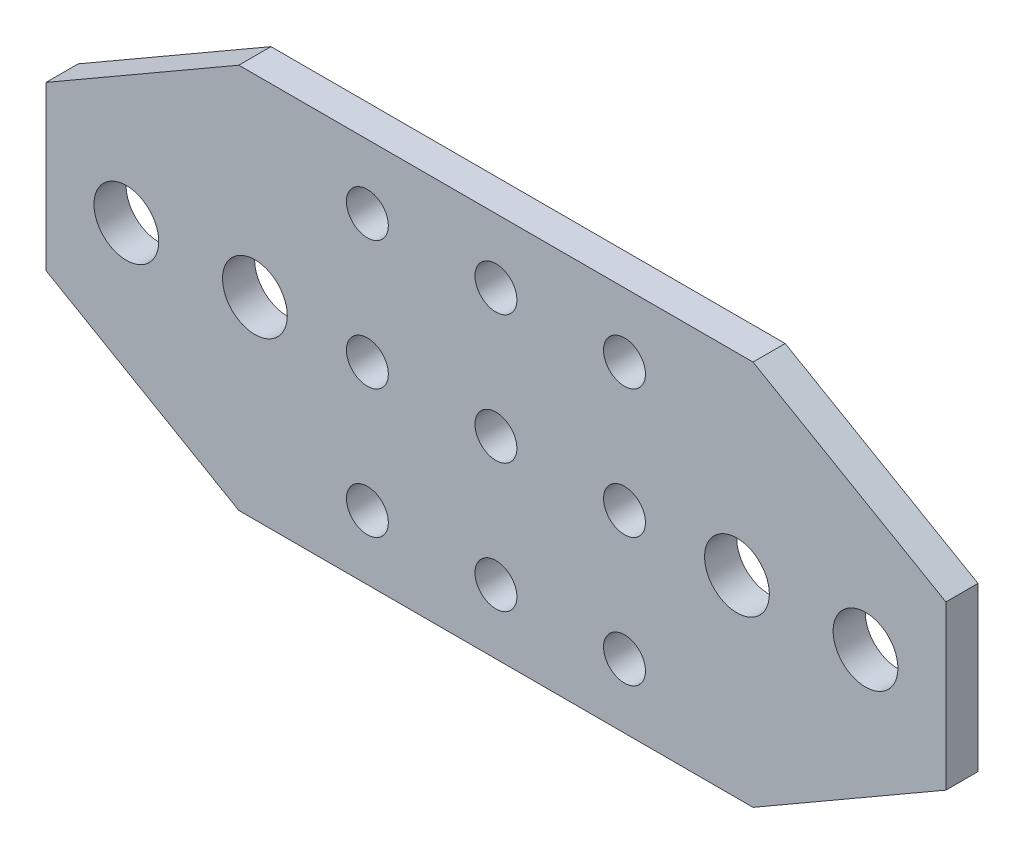
ISO-10303-21;
HEADER;
FILE_DESCRIPTION(('STEP AP214'),'2;1');
FILE_NAME('part.step','',(''),(''),'','','');
FILE_SCHEMA(('AUTOMOTIVE_DESIGN { 1 0 10303 214 1 1 1 1 }'));
ENDSEC;
DATA;
#1=APPLICATION_CONTEXT('core data for automotive mechanical design processes');
#2=APPLICATION_PROTOCOL_DEFINITION('international standard','automotive_design',2000,#1);
#3=PRODUCT_CONTEXT('',#1,'mechanical');
#4=PRODUCT('Part','Part','',(#3));
#5=PRODUCT_RELATED_PRODUCT_CATEGORY('part','',(#4));
#6=PRODUCT_DEFINITION_FORMATION('','',#4);
#7=PRODUCT_DEFINITION_CONTEXT('part definition',#1,'design');
#8=PRODUCT_DEFINITION('design','',#6,#7);
#9=PRODUCT_DEFINITION_SHAPE('','',#8);
#10=(LENGTH_UNIT() NAMED_UNIT(*) SI_UNIT(.MILLI.,.METRE.));
#11=(NAMED_UNIT(*) PLANE_ANGLE_UNIT() SI_UNIT($,.RADIAN.));
#12=(NAMED_UNIT(*) SI_UNIT($,.STERADIAN.) SOLID_ANGLE_UNIT());
#13=UNCERTAINTY_MEASURE_WITH_UNIT(LENGTH_MEASURE(1.E-05),#10,'distance_accuracy_value','');
#14=(GEOMETRIC_REPRESENTATION_CONTEXT(3) GLOBAL_UNCERTAINTY_ASSIGNED_CONTEXT((#13)) GLOBAL_UNIT_ASSIGNED_CONTEXT((#10,
#11,#12)) REPRESENTATION_CONTEXT('',''));
#15=CARTESIAN_POINT('',(0.,0.,0.));
#16=DIRECTION('',(0.,0.,1.));
#17=DIRECTION('',(1.,0.,0.));
#18=AXIS2_PLACEMENT_3D('',#15,#16,#17);
#19=CARTESIAN_POINT('',(-25.4,-19.05,3.175));
#20=DIRECTION('',(-0.499999999999995,-0.866025403784442,0.));
#21=DIRECTION('',(0.866025403784442,-0.499999999999995,0.));
#22=AXIS2_PLACEMENT_3D('',#19,#20,#21);
#23=PLANE('',#22);
#24=DIRECTION('',(-0.866025403784442,0.499999999999995,0.));
#25=VECTOR('',#24,1.);
#26=CARTESIAN_POINT('',(-25.4,-19.05,0.));
#27=LINE('',#26,#25);
#28=CARTESIAN_POINT('',(-25.4,-19.05,0.));
#29=VERTEX_POINT('',#28);
#30=CARTESIAN_POINT('',(-44.45,-8.05147737193778,0.));
#31=VERTEX_POINT('',#30);
#32=EDGE_CURVE('E129',#29,#31,#27,.T.);
#33=ORIENTED_EDGE('',*,*,#32,.F.);
#34=DIRECTION('',(0.,0.,-1.));
#35=VECTOR('',#34,1.);
#36=CARTESIAN_POINT('',(-25.4,-19.05,3.175));
#37=LINE('',#36,#35);
#38=CARTESIAN_POINT('',(-25.4,-19.05,3.175));
#39=VERTEX_POINT('',#38);
#40=EDGE_CURVE('E11',#39,#29,#37,.T.);
#41=ORIENTED_EDGE('',*,*,#40,.F.);
#42=DIRECTION('',(-0.866025403784442,0.499999999999995,0.));
#43=VECTOR('',#42,1.);
#44=CARTESIAN_POINT('',(-25.4,-19.05,3.175));
#45=LINE('',#44,#43);
#46=CARTESIAN_POINT('',(-44.45,-8.05147737193778,3.175));
#47=VERTEX_POINT('',#46);
#48=EDGE_CURVE('E150',#39,#47,#45,.T.);
#49=ORIENTED_EDGE('',*,*,#48,.T.);
#50=DIRECTION('',(0.,0.,-1.));
#51=VECTOR('',#50,1.);
#52=CARTESIAN_POINT('',(-44.45,-8.05147737193778,3.175));
#53=LINE('',#52,#51);
#54=EDGE_CURVE('E35',#47,#31,#53,.T.);
#55=ORIENTED_EDGE('',*,*,#54,.T.);
#56=EDGE_LOOP('',(#33,#41,#49,#55));
#57=FACE_BOUND('',#56,.T.);
#58=ADVANCED_FACE('F32',(#57),#23,.T.);
#59=CARTESIAN_POINT('',(25.4,-19.05,3.175));
#60=DIRECTION('',(0.,-1.,0.));
#61=DIRECTION('',(0.,0.,-1.));
#62=AXIS2_PLACEMENT_3D('',#59,#60,#61);
#63=PLANE('',#62);
#64=DIRECTION('',(-1.,0.,0.));
#65=VECTOR('',#64,1.);
#66=CARTESIAN_POINT('',(25.4,-19.05,0.));
#67=LINE('',#66,#65);
#68=CARTESIAN_POINT('',(25.4,-19.05,0.));
#69=VERTEX_POINT('',#68);
#70=EDGE_CURVE('E148',#69,#29,#67,.T.);
#71=ORIENTED_EDGE('',*,*,#70,.F.);
#72=DIRECTION('',(0.,0.,-1.));
#73=VECTOR('',#72,1.);
#74=CARTESIAN_POINT('',(25.4,-19.05,3.175));
#75=LINE('',#74,#73);
#76=CARTESIAN_POINT('',(25.4,-19.05,3.175));
#77=VERTEX_POINT('',#76);
#78=EDGE_CURVE('E41',#77,#69,#75,.T.);
#79=ORIENTED_EDGE('',*,*,#78,.F.);
#80=DIRECTION('',(-1.,0.,0.));
#81=VECTOR('',#80,1.);
#82=CARTESIAN_POINT('',(25.4,-19.05,3.175));
#83=LINE('',#82,#81);
#84=EDGE_CURVE('E119',#77,#39,#83,.T.);
#85=ORIENTED_EDGE('',*,*,#84,.T.);
#86=ORIENTED_EDGE('',*,*,#40,.T.);
#87=EDGE_LOOP('',(#71,#79,#85,#86));
#88=FACE_BOUND('',#87,.T.);
#89=ADVANCED_FACE('F162',(#88),#63,.T.);
#90=CARTESIAN_POINT('',(44.45,-8.05147737193777,3.175));
#91=DIRECTION('',(0.499999999999996,-0.866025403784441,0.));
#92=DIRECTION('',(0.866025403784441,0.499999999999996,0.));
#93=AXIS2_PLACEMENT_3D('',#90,#91,#92);
#94=PLANE('',#93);
#95=DIRECTION('',(-0.866025403784441,-0.499999999999996,0.));
#96=VECTOR('',#95,1.);
#97=CARTESIAN_POINT('',(44.45,-8.05147737193777,0.));
#98=LINE('',#97,#96);
#99=CARTESIAN_POINT('',(44.45,-8.05147737193777,0.));
#100=VERTEX_POINT('',#99);
#101=EDGE_CURVE('E106',#100,#69,#98,.T.);
#102=ORIENTED_EDGE('',*,*,#101,.F.);
#103=DIRECTION('',(0.,0.,-1.));
#104=VECTOR('',#103,1.);
#105=CARTESIAN_POINT('',(44.45,-8.05147737193777,3.175));
#106=LINE('',#105,#104);
#107=CARTESIAN_POINT('',(44.45,-8.05147737193777,3.175));
#108=VERTEX_POINT('',#107);
#109=EDGE_CURVE('E101',#108,#100,#106,.T.);
#110=ORIENTED_EDGE('',*,*,#109,.F.);
#111=DIRECTION('',(-0.866025403784441,-0.499999999999996,0.));
#112=VECTOR('',#111,1.);
#113=CARTESIAN_POINT('',(44.45,-8.05147737193777,3.175));
#114=LINE('',#113,#112);
#115=EDGE_CURVE('E104',#108,#77,#114,.T.);
#116=ORIENTED_EDGE('',*,*,#115,.T.);
#117=ORIENTED_EDGE('',*,*,#78,.T.);
#118=EDGE_LOOP('',(#102,#110,#116,#117));
#119=FACE_BOUND('',#118,.T.);
#120=ADVANCED_FACE('F103',(#119),#94,.T.);
#121=CARTESIAN_POINT('',(44.45,8.05147737193778,3.175));
#122=DIRECTION('',(1.,0.,0.));
#123=DIRECTION('',(0.,1.,0.));
#124=AXIS2_PLACEMENT_3D('',#121,#122,#123);
#125=PLANE('',#124);
#126=DIRECTION('',(0.,-1.,0.));
#127=VECTOR('',#126,1.);
#128=CARTESIAN_POINT('',(44.45,8.05147737193778,0.));
#129=LINE('',#128,#127);
#130=CARTESIAN_POINT('',(44.45,8.05147737193778,0.));
#131=VERTEX_POINT('',#130);
#132=EDGE_CURVE('E145',#131,#100,#129,.T.);
#133=ORIENTED_EDGE('',*,*,#132,.F.);
#134=DIRECTION('',(0.,0.,-1.));
#135=VECTOR('',#134,1.);
#136=CARTESIAN_POINT('',(44.45,8.05147737193778,3.175));
#137=LINE('',#136,#135);
#138=CARTESIAN_POINT('',(44.45,8.05147737193778,3.175));
#139=VERTEX_POINT('',#138);
#140=EDGE_CURVE('E111',#139,#131,#137,.T.);
#141=ORIENTED_EDGE('',*,*,#140,.F.);
#142=DIRECTION('',(0.,-1.,0.));
#143=VECTOR('',#142,1.);
#144=CARTESIAN_POINT('',(44.45,8.05147737193778,3.175));
#145=LINE('',#144,#143);
#146=EDGE_CURVE('E117',#139,#108,#145,.T.);
#147=ORIENTED_EDGE('',*,*,#146,.T.);
#148=ORIENTED_EDGE('',*,*,#109,.T.);
#149=EDGE_LOOP('',(#133,#141,#147,#148));
#150=FACE_BOUND('',#149,.T.);
#151=ADVANCED_FACE('F121',(#150),#125,.T.);
#152=CARTESIAN_POINT('',(25.4,19.05,3.175));
#153=DIRECTION('',(0.499999999999995,0.866025403784442,0.));
#154=DIRECTION('',(-0.866025403784442,0.499999999999995,0.));
#155=AXIS2_PLACEMENT_3D('',#152,#153,#154);
#156=PLANE('',#155);
#157=DIRECTION('',(0.866025403784442,-0.499999999999995,0.));
#158=VECTOR('',#157,1.);
#159=CARTESIAN_POINT('',(25.4,19.05,0.));
#160=LINE('',#159,#158);
#161=CARTESIAN_POINT('',(25.4,19.05,0.));
#162=VERTEX_POINT('',#161);
#163=EDGE_CURVE('E142',#162,#131,#160,.T.);
#164=ORIENTED_EDGE('',*,*,#163,.F.);
#165=DIRECTION('',(0.,0.,-1.));
#166=VECTOR('',#165,1.);
#167=CARTESIAN_POINT('',(25.4,19.05,3.175));
#168=LINE('',#167,#166);
#169=CARTESIAN_POINT('',(25.4,19.05,3.175));
#170=VERTEX_POINT('',#169);
#171=EDGE_CURVE('E154',#170,#162,#168,.T.);
#172=ORIENTED_EDGE('',*,*,#171,.F.);
#173=DIRECTION('',(0.866025403784442,-0.499999999999995,0.));
#174=VECTOR('',#173,1.);
#175=CARTESIAN_POINT('',(25.4,19.05,3.175));
#176=LINE('',#175,#174);
#177=EDGE_CURVE('E122',#170,#139,#176,.T.);
#178=ORIENTED_EDGE('',*,*,#177,.T.);
#179=ORIENTED_EDGE('',*,*,#140,.T.);
#180=EDGE_LOOP('',(#164,#172,#178,#179));
#181=FACE_BOUND('',#180,.T.);
#182=ADVANCED_FACE('F175',(#181),#156,.T.);
#183=CARTESIAN_POINT('',(-25.4,19.05,3.175));
#184=DIRECTION('',(0.,1.,0.));
#185=DIRECTION('',(0.,0.,1.));
#186=AXIS2_PLACEMENT_3D('',#183,#184,#185);
#187=PLANE('',#186);
#188=DIRECTION('',(1.,0.,0.));
#189=VECTOR('',#188,1.);
#190=CARTESIAN_POINT('',(-25.4,19.05,0.));
#191=LINE('',#190,#189);
#192=CARTESIAN_POINT('',(-25.4,19.05,0.));
#193=VERTEX_POINT('',#192);
#194=EDGE_CURVE('E139',#193,#162,#191,.T.);
#195=ORIENTED_EDGE('',*,*,#194,.F.);
#196=DIRECTION('',(0.,0.,-1.));
#197=VECTOR('',#196,1.);
#198=CARTESIAN_POINT('',(-25.4,19.05,3.175));
#199=LINE('',#198,#197);
#200=CARTESIAN_POINT('',(-25.4,19.05,3.175));
#201=VERTEX_POINT('',#200);
#202=EDGE_CURVE('E156',#201,#193,#199,.T.);
#203=ORIENTED_EDGE('',*,*,#202,.F.);
#204=DIRECTION('',(1.,0.,0.));
#205=VECTOR('',#204,1.);
#206=CARTESIAN_POINT('',(-25.4,19.05,3.175));
#207=LINE('',#206,#205);
#208=EDGE_CURVE('E124',#201,#170,#207,.T.);
#209=ORIENTED_EDGE('',*,*,#208,.T.);
#210=ORIENTED_EDGE('',*,*,#171,.T.);
#211=EDGE_LOOP('',(#195,#203,#209,#210));
#212=FACE_BOUND('',#211,.T.);
#213=ADVANCED_FACE('F178',(#212),#187,.T.);
#214=CARTESIAN_POINT('',(-44.45,8.05147737193778,3.175));
#215=DIRECTION('',(-0.499999999999995,0.866025403784442,0.));
#216=DIRECTION('',(-0.866025403784442,-0.499999999999995,0.));
#217=AXIS2_PLACEMENT_3D('',#214,#215,#216);
#218=PLANE('',#217);
#219=DIRECTION('',(0.866025403784442,0.499999999999995,0.));
#220=VECTOR('',#219,1.);
#221=CARTESIAN_POINT('',(-44.45,8.05147737193778,0.));
#222=LINE('',#221,#220);
#223=CARTESIAN_POINT('',(-44.45,8.05147737193778,0.));
#224=VERTEX_POINT('',#223);
#225=EDGE_CURVE('E136',#224,#193,#222,.T.);
#226=ORIENTED_EDGE('',*,*,#225,.F.);
#227=DIRECTION('',(0.,0.,-1.));
#228=VECTOR('',#227,1.);
#229=CARTESIAN_POINT('',(-44.45,8.05147737193778,3.175));
#230=LINE('',#229,#228);
#231=CARTESIAN_POINT('',(-44.45,8.05147737193778,3.175));
#232=VERTEX_POINT('',#231);
#233=EDGE_CURVE('E157',#232,#224,#230,.T.);
#234=ORIENTED_EDGE('',*,*,#233,.F.);
#235=DIRECTION('',(0.866025403784442,0.499999999999995,0.));
#236=VECTOR('',#235,1.);
#237=CARTESIAN_POINT('',(-44.45,8.05147737193778,3.175));
#238=LINE('',#237,#236);
#239=EDGE_CURVE('E334',#232,#201,#238,.T.);
#240=ORIENTED_EDGE('',*,*,#239,.T.);
#241=ORIENTED_EDGE('',*,*,#202,.T.);
#242=EDGE_LOOP('',(#226,#234,#240,#241));
#243=FACE_BOUND('',#242,.T.);
#244=ADVANCED_FACE('F182',(#243),#218,.T.);
#245=CARTESIAN_POINT('',(-44.45,-8.05147737193778,3.175));
#246=DIRECTION('',(-1.,0.,0.));
#247=DIRECTION('',(0.,-1.,0.));
#248=AXIS2_PLACEMENT_3D('',#245,#246,#247);
#249=PLANE('',#248);
#250=DIRECTION('',(0.,1.,0.));
#251=VECTOR('',#250,1.);
#252=CARTESIAN_POINT('',(-44.45,-8.05147737193778,0.));
#253=LINE('',#252,#251);
#254=EDGE_CURVE('E132',#31,#224,#253,.T.);
#255=ORIENTED_EDGE('',*,*,#254,.F.);
#256=ORIENTED_EDGE('',*,*,#54,.F.);
#257=DIRECTION('',(0.,1.,0.));
#258=VECTOR('',#257,1.);
#259=CARTESIAN_POINT('',(-44.45,-8.05147737193778,3.175));
#260=LINE('',#259,#258);
#261=EDGE_CURVE('E332',#47,#232,#260,.T.);
#262=ORIENTED_EDGE('',*,*,#261,.T.);
#263=ORIENTED_EDGE('',*,*,#233,.T.);
#264=EDGE_LOOP('',(#255,#256,#262,#263));
#265=FACE_BOUND('',#264,.T.);
#266=ADVANCED_FACE('F159',(#265),#249,.T.);
#267=CARTESIAN_POINT('',(0.,0.,3.175));
#268=DIRECTION('',(0.,0.,-1.));
#269=DIRECTION('',(-1.,0.,0.));
#270=AXIS2_PLACEMENT_3D('',#267,#268,#269);
#271=PLANE('',#270);
#272=CARTESIAN_POINT('',(23.8125,0.,3.175));
#273=DIRECTION('',(0.,0.,-1.));
#274=DIRECTION('',(1.,0.,0.));
#275=AXIS2_PLACEMENT_3D('',#272,#273,#274);
#276=CIRCLE('',#275,3.2004);
#277=CARTESIAN_POINT('',(27.0129,0.,3.175));
#278=VERTEX_POINT('',#277);
#279=EDGE_CURVE('E253',#278,#278,#276,.T.);
#280=ORIENTED_EDGE('',*,*,#279,.T.);
#281=EDGE_LOOP('',(#280));
#282=FACE_BOUND('',#281,.T.);
#283=CARTESIAN_POINT('',(12.7,0.,3.175));
#284=DIRECTION('',(0.,0.,-1.));
#285=DIRECTION('',(1.,0.,0.));
#286=AXIS2_PLACEMENT_3D('',#283,#284,#285);
#287=CIRCLE('',#286,2.0701);
#288=CARTESIAN_POINT('',(14.7701,0.,3.175));
#289=VERTEX_POINT('',#288);
#290=EDGE_CURVE('E261',#289,#289,#287,.T.);
#291=ORIENTED_EDGE('',*,*,#290,.T.);
#292=EDGE_LOOP('',(#291));
#293=FACE_BOUND('',#292,.T.);
#294=CARTESIAN_POINT('',(-12.7,0.,3.175));
#295=DIRECTION('',(0.,0.,-1.));
#296=DIRECTION('',(1.,0.,0.));
#297=AXIS2_PLACEMENT_3D('',#294,#295,#296);
#298=CIRCLE('',#297,2.0701);
#299=CARTESIAN_POINT('',(-10.6299,0.,3.175));
#300=VERTEX_POINT('',#299);
#301=EDGE_CURVE('E267',#300,#300,#298,.T.);
#302=ORIENTED_EDGE('',*,*,#301,.T.);
#303=EDGE_LOOP('',(#302));
#304=FACE_BOUND('',#303,.T.);
#305=CARTESIAN_POINT('',(36.5125,0.,3.175));
#306=DIRECTION('',(0.,0.,-1.));
#307=DIRECTION('',(1.,0.,0.));
#308=AXIS2_PLACEMENT_3D('',#305,#306,#307);
#309=CIRCLE('',#308,3.2004);
#310=CARTESIAN_POINT('',(39.7129,0.,3.175));
#311=VERTEX_POINT('',#310);
#312=EDGE_CURVE('E273',#311,#311,#309,.T.);
#313=ORIENTED_EDGE('',*,*,#312,.T.);
#314=EDGE_LOOP('',(#313));
#315=FACE_BOUND('',#314,.T.);
#316=CARTESIAN_POINT('',(12.7,12.7,3.175));
#317=DIRECTION('',(0.,0.,-1.));
#318=DIRECTION('',(1.,0.,0.));
#319=AXIS2_PLACEMENT_3D('',#316,#317,#318);
#320=CIRCLE('',#319,2.0701);
#321=CARTESIAN_POINT('',(14.7701,12.7,3.175));
#322=VERTEX_POINT('',#321);
#323=EDGE_CURVE('E279',#322,#322,#320,.T.);
#324=ORIENTED_EDGE('',*,*,#323,.T.);
#325=EDGE_LOOP('',(#324));
#326=FACE_BOUND('',#325,.T.);
#327=CARTESIAN_POINT('',(-12.7,-12.7,3.175));
#328=DIRECTION('',(0.,0.,-1.));
#329=DIRECTION('',(1.,0.,0.));
#330=AXIS2_PLACEMENT_3D('',#327,#328,#329);
#331=CIRCLE('',#330,2.0701);
#332=CARTESIAN_POINT('',(-10.6299,-12.7,3.175));
#333=VERTEX_POINT('',#332);
#334=EDGE_CURVE('E285',#333,#333,#331,.T.);
#335=ORIENTED_EDGE('',*,*,#334,.T.);
#336=EDGE_LOOP('',(#335));
#337=FACE_BOUND('',#336,.T.);
#338=CARTESIAN_POINT('',(-12.7,12.7,3.175));
#339=DIRECTION('',(0.,0.,-1.));
#340=DIRECTION('',(1.,0.,0.));
#341=AXIS2_PLACEMENT_3D('',#338,#339,#340);
#342=CIRCLE('',#341,2.0701);
#343=CARTESIAN_POINT('',(-10.6299,12.7,3.175));
#344=VERTEX_POINT('',#343);
#345=EDGE_CURVE('E291',#344,#344,#342,.T.);
#346=ORIENTED_EDGE('',*,*,#345,.T.);
#347=EDGE_LOOP('',(#346));
#348=FACE_BOUND('',#347,.T.);
#349=CARTESIAN_POINT('',(12.7,-12.7,3.175));
#350=DIRECTION('',(0.,0.,-1.));
#351=DIRECTION('',(1.,0.,0.));
#352=AXIS2_PLACEMENT_3D('',#349,#350,#351);
#353=CIRCLE('',#352,2.0701);
#354=CARTESIAN_POINT('',(14.7701,-12.7,3.175));
#355=VERTEX_POINT('',#354);
#356=EDGE_CURVE('E297',#355,#355,#353,.T.);
#357=ORIENTED_EDGE('',*,*,#356,.T.);
#358=EDGE_LOOP('',(#357));
#359=FACE_BOUND('',#358,.T.);
#360=CARTESIAN_POINT('',(-36.5125,0.,3.175));
#361=DIRECTION('',(0.,0.,-1.));
#362=DIRECTION('',(1.,0.,0.));
#363=AXIS2_PLACEMENT_3D('',#360,#361,#362);
#364=CIRCLE('',#363,3.2004);
#365=CARTESIAN_POINT('',(-33.3121,0.,3.175));
#366=VERTEX_POINT('',#365);
#367=EDGE_CURVE('E303',#366,#366,#364,.T.);
#368=ORIENTED_EDGE('',*,*,#367,.T.);
#369=EDGE_LOOP('',(#368));
#370=FACE_BOUND('',#369,.T.);
#371=CARTESIAN_POINT('',(0.,0.,3.175));
#372=DIRECTION('',(0.,0.,-1.));
#373=DIRECTION('',(1.,0.,0.));
#374=AXIS2_PLACEMENT_3D('',#371,#372,#373);
#375=CIRCLE('',#374,2.0701);
#376=CARTESIAN_POINT('',(2.0701,0.,3.175));
#377=VERTEX_POINT('',#376);
#378=EDGE_CURVE('E309',#377,#377,#375,.T.);
#379=ORIENTED_EDGE('',*,*,#378,.T.);
#380=EDGE_LOOP('',(#379));
#381=FACE_BOUND('',#380,.T.);
#382=CARTESIAN_POINT('',(0.,12.7,3.175));
#383=DIRECTION('',(0.,0.,-1.));
#384=DIRECTION('',(1.,0.,0.));
#385=AXIS2_PLACEMENT_3D('',#382,#383,#384);
#386=CIRCLE('',#385,2.0701);
#387=CARTESIAN_POINT('',(2.07009999999999,12.7,3.175));
#388=VERTEX_POINT('',#387);
#389=EDGE_CURVE('E315',#388,#388,#386,.T.);
#390=ORIENTED_EDGE('',*,*,#389,.T.);
#391=EDGE_LOOP('',(#390));
#392=FACE_BOUND('',#391,.T.);
#393=CARTESIAN_POINT('',(0.,-12.7,3.175));
#394=DIRECTION('',(0.,0.,-1.));
#395=DIRECTION('',(1.,0.,0.));
#396=AXIS2_PLACEMENT_3D('',#393,#394,#395);
#397=CIRCLE('',#396,2.0701);
#398=CARTESIAN_POINT('',(2.07009999999999,-12.7,3.175));
#399=VERTEX_POINT('',#398);
#400=EDGE_CURVE('E321',#399,#399,#397,.T.);
#401=ORIENTED_EDGE('',*,*,#400,.T.);
#402=EDGE_LOOP('',(#401));
#403=FACE_BOUND('',#402,.T.);
#404=CARTESIAN_POINT('',(-23.8125,0.,3.175));
#405=DIRECTION('',(0.,0.,-1.));
#406=DIRECTION('',(1.,0.,0.));
#407=AXIS2_PLACEMENT_3D('',#404,#405,#406);
#408=CIRCLE('',#407,3.2004);
#409=CARTESIAN_POINT('',(-20.6121,0.,3.175));
#410=VERTEX_POINT('',#409);
#411=EDGE_CURVE('E133',#410,#410,#408,.T.);
#412=ORIENTED_EDGE('',*,*,#411,.T.);
#413=EDGE_LOOP('',(#412));
#414=FACE_BOUND('',#413,.T.);
#415=ORIENTED_EDGE('',*,*,#48,.F.);
#416=ORIENTED_EDGE('',*,*,#84,.F.);
#417=ORIENTED_EDGE('',*,*,#115,.F.);
#418=ORIENTED_EDGE('',*,*,#146,.F.);
#419=ORIENTED_EDGE('',*,*,#177,.F.);
#420=ORIENTED_EDGE('',*,*,#208,.F.);
#421=ORIENTED_EDGE('',*,*,#239,.F.);
#422=ORIENTED_EDGE('',*,*,#261,.F.);
#423=EDGE_LOOP('',(#415,#416,#417,#418,#419,#420,#421,#422));
#424=FACE_BOUND('',#423,.T.);
#425=ADVANCED_FACE('F115',(#282,#293,#304,#315,#326,#337,#348,#359,#370,#381,#392,#403,#414,
#424),#271,.F.);
#426=CARTESIAN_POINT('',(0.,0.,0.));
#427=DIRECTION('',(0.,0.,-1.));
#428=DIRECTION('',(-1.,0.,0.));
#429=AXIS2_PLACEMENT_3D('',#426,#427,#428);
#430=PLANE('',#429);
#431=CARTESIAN_POINT('',(23.8125,0.,0.));
#432=DIRECTION('',(0.,0.,-1.));
#433=DIRECTION('',(1.,0.,0.));
#434=AXIS2_PLACEMENT_3D('',#431,#432,#433);
#435=CIRCLE('',#434,3.2004);
#436=CARTESIAN_POINT('',(27.0129,0.,0.));
#437=VERTEX_POINT('',#436);
#438=EDGE_CURVE('E256',#437,#437,#435,.T.);
#439=ORIENTED_EDGE('',*,*,#438,.F.);
#440=EDGE_LOOP('',(#439));
#441=FACE_BOUND('',#440,.T.);
#442=CARTESIAN_POINT('',(12.7,0.,0.));
#443=DIRECTION('',(0.,0.,-1.));
#444=DIRECTION('',(1.,0.,0.));
#445=AXIS2_PLACEMENT_3D('',#442,#443,#444);
#446=CIRCLE('',#445,2.0701);
#447=CARTESIAN_POINT('',(14.7701,0.,0.));
#448=VERTEX_POINT('',#447);
#449=EDGE_CURVE('E258',#448,#448,#446,.T.);
#450=ORIENTED_EDGE('',*,*,#449,.F.);
#451=EDGE_LOOP('',(#450));
#452=FACE_BOUND('',#451,.T.);
#453=CARTESIAN_POINT('',(-12.7,0.,0.));
#454=DIRECTION('',(0.,0.,-1.));
#455=DIRECTION('',(1.,0.,0.));
#456=AXIS2_PLACEMENT_3D('',#453,#454,#455);
#457=CIRCLE('',#456,2.0701);
#458=CARTESIAN_POINT('',(-10.6299,0.,0.));
#459=VERTEX_POINT('',#458);
#460=EDGE_CURVE('E264',#459,#459,#457,.T.);
#461=ORIENTED_EDGE('',*,*,#460,.F.);
#462=EDGE_LOOP('',(#461));
#463=FACE_BOUND('',#462,.T.);
#464=CARTESIAN_POINT('',(36.5125,0.,0.));
#465=DIRECTION('',(0.,0.,-1.));
#466=DIRECTION('',(1.,0.,0.));
#467=AXIS2_PLACEMENT_3D('',#464,#465,#466);
#468=CIRCLE('',#467,3.2004);
#469=CARTESIAN_POINT('',(39.7129,0.,0.));
#470=VERTEX_POINT('',#469);
#471=EDGE_CURVE('E270',#470,#470,#468,.T.);
#472=ORIENTED_EDGE('',*,*,#471,.F.);
#473=EDGE_LOOP('',(#472));
#474=FACE_BOUND('',#473,.T.);
#475=CARTESIAN_POINT('',(12.7,12.7,0.));
#476=DIRECTION('',(0.,0.,-1.));
#477=DIRECTION('',(1.,0.,0.));
#478=AXIS2_PLACEMENT_3D('',#475,#476,#477);
#479=CIRCLE('',#478,2.0701);
#480=CARTESIAN_POINT('',(14.7701,12.7,0.));
#481=VERTEX_POINT('',#480);
#482=EDGE_CURVE('E276',#481,#481,#479,.T.);
#483=ORIENTED_EDGE('',*,*,#482,.F.);
#484=EDGE_LOOP('',(#483));
#485=FACE_BOUND('',#484,.T.);
#486=CARTESIAN_POINT('',(-12.7,-12.7,0.));
#487=DIRECTION('',(0.,0.,-1.));
#488=DIRECTION('',(1.,0.,0.));
#489=AXIS2_PLACEMENT_3D('',#486,#487,#488);
#490=CIRCLE('',#489,2.0701);
#491=CARTESIAN_POINT('',(-10.6299,-12.7,0.));
#492=VERTEX_POINT('',#491);
#493=EDGE_CURVE('E282',#492,#492,#490,.T.);
#494=ORIENTED_EDGE('',*,*,#493,.F.);
#495=EDGE_LOOP('',(#494));
#496=FACE_BOUND('',#495,.T.);
#497=CARTESIAN_POINT('',(-12.7,12.7,0.));
#498=DIRECTION('',(0.,0.,-1.));
#499=DIRECTION('',(1.,0.,0.));
#500=AXIS2_PLACEMENT_3D('',#497,#498,#499);
#501=CIRCLE('',#500,2.0701);
#502=CARTESIAN_POINT('',(-10.6299,12.7,0.));
#503=VERTEX_POINT('',#502);
#504=EDGE_CURVE('E288',#503,#503,#501,.T.);
#505=ORIENTED_EDGE('',*,*,#504,.F.);
#506=EDGE_LOOP('',(#505));
#507=FACE_BOUND('',#506,.T.);
#508=CARTESIAN_POINT('',(12.7,-12.7,0.));
#509=DIRECTION('',(0.,0.,-1.));
#510=DIRECTION('',(1.,0.,0.));
#511=AXIS2_PLACEMENT_3D('',#508,#509,#510);
#512=CIRCLE('',#511,2.0701);
#513=CARTESIAN_POINT('',(14.7701,-12.7,0.));
#514=VERTEX_POINT('',#513);
#515=EDGE_CURVE('E294',#514,#514,#512,.T.);
#516=ORIENTED_EDGE('',*,*,#515,.F.);
#517=EDGE_LOOP('',(#516));
#518=FACE_BOUND('',#517,.T.);
#519=CARTESIAN_POINT('',(-36.5125,0.,0.));
#520=DIRECTION('',(0.,0.,-1.));
#521=DIRECTION('',(1.,0.,0.));
#522=AXIS2_PLACEMENT_3D('',#519,#520,#521);
#523=CIRCLE('',#522,3.2004);
#524=CARTESIAN_POINT('',(-33.3121,0.,0.));
#525=VERTEX_POINT('',#524);
#526=EDGE_CURVE('E300',#525,#525,#523,.T.);
#527=ORIENTED_EDGE('',*,*,#526,.F.);
#528=EDGE_LOOP('',(#527));
#529=FACE_BOUND('',#528,.T.);
#530=CARTESIAN_POINT('',(0.,0.,0.));
#531=DIRECTION('',(0.,0.,-1.));
#532=DIRECTION('',(1.,0.,0.));
#533=AXIS2_PLACEMENT_3D('',#530,#531,#532);
#534=CIRCLE('',#533,2.0701);
#535=CARTESIAN_POINT('',(2.0701,0.,0.));
#536=VERTEX_POINT('',#535);
#537=EDGE_CURVE('E306',#536,#536,#534,.T.);
#538=ORIENTED_EDGE('',*,*,#537,.F.);
#539=EDGE_LOOP('',(#538));
#540=FACE_BOUND('',#539,.T.);
#541=CARTESIAN_POINT('',(0.,12.7,0.));
#542=DIRECTION('',(0.,0.,-1.));
#543=DIRECTION('',(1.,0.,0.));
#544=AXIS2_PLACEMENT_3D('',#541,#542,#543);
#545=CIRCLE('',#544,2.0701);
#546=CARTESIAN_POINT('',(2.07009999999999,12.7,0.));
#547=VERTEX_POINT('',#546);
#548=EDGE_CURVE('E312',#547,#547,#545,.T.);
#549=ORIENTED_EDGE('',*,*,#548,.F.);
#550=EDGE_LOOP('',(#549));
#551=FACE_BOUND('',#550,.T.);
#552=CARTESIAN_POINT('',(0.,-12.7,0.));
#553=DIRECTION('',(0.,0.,-1.));
#554=DIRECTION('',(1.,0.,0.));
#555=AXIS2_PLACEMENT_3D('',#552,#553,#554);
#556=CIRCLE('',#555,2.0701);
#557=CARTESIAN_POINT('',(2.07009999999999,-12.7,0.));
#558=VERTEX_POINT('',#557);
#559=EDGE_CURVE('E318',#558,#558,#556,.T.);
#560=ORIENTED_EDGE('',*,*,#559,.F.);
#561=EDGE_LOOP('',(#560));
#562=FACE_BOUND('',#561,.T.);
#563=CARTESIAN_POINT('',(-23.8125,0.,0.));
#564=DIRECTION('',(0.,0.,-1.));
#565=DIRECTION('',(1.,0.,0.));
#566=AXIS2_PLACEMENT_3D('',#563,#564,#565);
#567=CIRCLE('',#566,3.2004);
#568=CARTESIAN_POINT('',(-20.6121,0.,0.));
#569=VERTEX_POINT('',#568);
#570=EDGE_CURVE('E324',#569,#569,#567,.T.);
#571=ORIENTED_EDGE('',*,*,#570,.F.);
#572=EDGE_LOOP('',(#571));
#573=FACE_BOUND('',#572,.T.);
#574=ORIENTED_EDGE('',*,*,#32,.T.);
#575=ORIENTED_EDGE('',*,*,#254,.T.);
#576=ORIENTED_EDGE('',*,*,#225,.T.);
#577=ORIENTED_EDGE('',*,*,#194,.T.);
#578=ORIENTED_EDGE('',*,*,#163,.T.);
#579=ORIENTED_EDGE('',*,*,#132,.T.);
#580=ORIENTED_EDGE('',*,*,#101,.T.);
#581=ORIENTED_EDGE('',*,*,#70,.T.);
#582=EDGE_LOOP('',(#574,#575,#576,#577,#578,#579,#580,#581));
#583=FACE_BOUND('',#582,.T.);
#584=ADVANCED_FACE('F161',(#441,#452,#463,#474,#485,#496,#507,#518,#529,#540,#551,#562,#573,
#583),#430,.T.);
#585=CARTESIAN_POINT('',(-23.8125,0.,3.175));
#586=DIRECTION('',(0.,0.,-1.));
#587=DIRECTION('',(-1.,0.,0.));
#588=AXIS2_PLACEMENT_3D('',#585,#586,#587);
#589=CYLINDRICAL_SURFACE('',#588,3.2004);
#590=ORIENTED_EDGE('',*,*,#411,.F.);
#591=EDGE_LOOP('',(#590));
#592=FACE_BOUND('',#591,.T.);
#593=ORIENTED_EDGE('',*,*,#570,.T.);
#594=EDGE_LOOP('',(#593));
#595=FACE_BOUND('',#594,.T.);
#596=ADVANCED_FACE('F194',(#592,#595),#589,.F.);
#597=CARTESIAN_POINT('',(0.,-12.7,3.175));
#598=DIRECTION('',(0.,0.,-1.));
#599=DIRECTION('',(-1.,0.,0.));
#600=AXIS2_PLACEMENT_3D('',#597,#598,#599);
#601=CYLINDRICAL_SURFACE('',#600,2.0701);
#602=ORIENTED_EDGE('',*,*,#400,.F.);
#603=EDGE_LOOP('',(#602));
#604=FACE_BOUND('',#603,.T.);
#605=ORIENTED_EDGE('',*,*,#559,.T.);
#606=EDGE_LOOP('',(#605));
#607=FACE_BOUND('',#606,.T.);
#608=ADVANCED_FACE('F201',(#604,#607),#601,.F.);
#609=CARTESIAN_POINT('',(0.,12.7,3.175));
#610=DIRECTION('',(0.,0.,-1.));
#611=DIRECTION('',(-1.,0.,0.));
#612=AXIS2_PLACEMENT_3D('',#609,#610,#611);
#613=CYLINDRICAL_SURFACE('',#612,2.0701);
#614=ORIENTED_EDGE('',*,*,#389,.F.);
#615=EDGE_LOOP('',(#614));
#616=FACE_BOUND('',#615,.T.);
#617=ORIENTED_EDGE('',*,*,#548,.T.);
#618=EDGE_LOOP('',(#617));
#619=FACE_BOUND('',#618,.T.);
#620=ADVANCED_FACE('F205',(#616,#619),#613,.F.);
#621=CARTESIAN_POINT('',(0.,0.,3.175));
#622=DIRECTION('',(0.,0.,-1.));
#623=DIRECTION('',(-1.,0.,0.));
#624=AXIS2_PLACEMENT_3D('',#621,#622,#623);
#625=CYLINDRICAL_SURFACE('',#624,2.0701);
#626=ORIENTED_EDGE('',*,*,#378,.F.);
#627=EDGE_LOOP('',(#626));
#628=FACE_BOUND('',#627,.T.);
#629=ORIENTED_EDGE('',*,*,#537,.T.);
#630=EDGE_LOOP('',(#629));
#631=FACE_BOUND('',#630,.T.);
#632=ADVANCED_FACE('F209',(#628,#631),#625,.F.);
#633=CARTESIAN_POINT('',(-36.5125,0.,3.175));
#634=DIRECTION('',(0.,0.,-1.));
#635=DIRECTION('',(-1.,0.,0.));
#636=AXIS2_PLACEMENT_3D('',#633,#634,#635);
#637=CYLINDRICAL_SURFACE('',#636,3.2004);
#638=ORIENTED_EDGE('',*,*,#367,.F.);
#639=EDGE_LOOP('',(#638));
#640=FACE_BOUND('',#639,.T.);
#641=ORIENTED_EDGE('',*,*,#526,.T.);
#642=EDGE_LOOP('',(#641));
#643=FACE_BOUND('',#642,.T.);
#644=ADVANCED_FACE('F213',(#640,#643),#637,.F.);
#645=CARTESIAN_POINT('',(12.7,-12.7,3.175));
#646=DIRECTION('',(0.,0.,-1.));
#647=DIRECTION('',(-1.,0.,0.));
#648=AXIS2_PLACEMENT_3D('',#645,#646,#647);
#649=CYLINDRICAL_SURFACE('',#648,2.0701);
#650=ORIENTED_EDGE('',*,*,#356,.F.);
#651=EDGE_LOOP('',(#650));
#652=FACE_BOUND('',#651,.T.);
#653=ORIENTED_EDGE('',*,*,#515,.T.);
#654=EDGE_LOOP('',(#653));
#655=FACE_BOUND('',#654,.T.);
#656=ADVANCED_FACE('F217',(#652,#655),#649,.F.);
#657=CARTESIAN_POINT('',(-12.7,12.7,3.175));
#658=DIRECTION('',(0.,0.,-1.));
#659=DIRECTION('',(-1.,0.,0.));
#660=AXIS2_PLACEMENT_3D('',#657,#658,#659);
#661=CYLINDRICAL_SURFACE('',#660,2.0701);
#662=ORIENTED_EDGE('',*,*,#345,.F.);
#663=EDGE_LOOP('',(#662));
#664=FACE_BOUND('',#663,.T.);
#665=ORIENTED_EDGE('',*,*,#504,.T.);
#666=EDGE_LOOP('',(#665));
#667=FACE_BOUND('',#666,.T.);
#668=ADVANCED_FACE('F221',(#664,#667),#661,.F.);
#669=CARTESIAN_POINT('',(-12.7,-12.7,3.175));
#670=DIRECTION('',(0.,0.,-1.));
#671=DIRECTION('',(-1.,0.,0.));
#672=AXIS2_PLACEMENT_3D('',#669,#670,#671);
#673=CYLINDRICAL_SURFACE('',#672,2.0701);
#674=ORIENTED_EDGE('',*,*,#334,.F.);
#675=EDGE_LOOP('',(#674));
#676=FACE_BOUND('',#675,.T.);
#677=ORIENTED_EDGE('',*,*,#493,.T.);
#678=EDGE_LOOP('',(#677));
#679=FACE_BOUND('',#678,.T.);
#680=ADVANCED_FACE('F225',(#676,#679),#673,.F.);
#681=CARTESIAN_POINT('',(12.7,12.7,3.175));
#682=DIRECTION('',(0.,0.,-1.));
#683=DIRECTION('',(-1.,0.,0.));
#684=AXIS2_PLACEMENT_3D('',#681,#682,#683);
#685=CYLINDRICAL_SURFACE('',#684,2.0701);
#686=ORIENTED_EDGE('',*,*,#323,.F.);
#687=EDGE_LOOP('',(#686));
#688=FACE_BOUND('',#687,.T.);
#689=ORIENTED_EDGE('',*,*,#482,.T.);
#690=EDGE_LOOP('',(#689));
#691=FACE_BOUND('',#690,.T.);
#692=ADVANCED_FACE('F229',(#688,#691),#685,.F.);
#693=CARTESIAN_POINT('',(36.5125,0.,3.175));
#694=DIRECTION('',(0.,0.,-1.));
#695=DIRECTION('',(-1.,0.,0.));
#696=AXIS2_PLACEMENT_3D('',#693,#694,#695);
#697=CYLINDRICAL_SURFACE('',#696,3.2004);
#698=ORIENTED_EDGE('',*,*,#312,.F.);
#699=EDGE_LOOP('',(#698));
#700=FACE_BOUND('',#699,.T.);
#701=ORIENTED_EDGE('',*,*,#471,.T.);
#702=EDGE_LOOP('',(#701));
#703=FACE_BOUND('',#702,.T.);
#704=ADVANCED_FACE('F233',(#700,#703),#697,.F.);
#705=CARTESIAN_POINT('',(-12.7,0.,3.175));
#706=DIRECTION('',(0.,0.,-1.));
#707=DIRECTION('',(-1.,0.,0.));
#708=AXIS2_PLACEMENT_3D('',#705,#706,#707);
#709=CYLINDRICAL_SURFACE('',#708,2.0701);
#710=ORIENTED_EDGE('',*,*,#301,.F.);
#711=EDGE_LOOP('',(#710));
#712=FACE_BOUND('',#711,.T.);
#713=ORIENTED_EDGE('',*,*,#460,.T.);
#714=EDGE_LOOP('',(#713));
#715=FACE_BOUND('',#714,.T.);
#716=ADVANCED_FACE('F237',(#712,#715),#709,.F.);
#717=CARTESIAN_POINT('',(12.7,0.,3.175));
#718=DIRECTION('',(0.,0.,-1.));
#719=DIRECTION('',(-1.,0.,0.));
#720=AXIS2_PLACEMENT_3D('',#717,#718,#719);
#721=CYLINDRICAL_SURFACE('',#720,2.0701);
#722=ORIENTED_EDGE('',*,*,#290,.F.);
#723=EDGE_LOOP('',(#722));
#724=FACE_BOUND('',#723,.T.);
#725=ORIENTED_EDGE('',*,*,#449,.T.);
#726=EDGE_LOOP('',(#725));
#727=FACE_BOUND('',#726,.T.);
#728=ADVANCED_FACE('F241',(#724,#727),#721,.F.);
#729=CARTESIAN_POINT('',(23.8125,0.,3.175));
#730=DIRECTION('',(0.,0.,-1.));
#731=DIRECTION('',(-1.,0.,0.));
#732=AXIS2_PLACEMENT_3D('',#729,#730,#731);
#733=CYLINDRICAL_SURFACE('',#732,3.2004);
#734=ORIENTED_EDGE('',*,*,#279,.F.);
#735=EDGE_LOOP('',(#734));
#736=FACE_BOUND('',#735,.T.);
#737=ORIENTED_EDGE('',*,*,#438,.T.);
#738=EDGE_LOOP('',(#737));
#739=FACE_BOUND('',#738,.T.);
#740=ADVANCED_FACE('F245',(#736,#739),#733,.F.);
#741=CLOSED_SHELL('',(#58,#89,#120,#151,#182,#213,#244,#266,#425,#584,#596,#608,#620,#632,#644,
#656,#668,#680,#692,#704,#716,#728,#740));
#742=MANIFOLD_SOLID_BREP('B2',#741);
#743=ADVANCED_BREP_SHAPE_REPRESENTATION('',(#18,#742),#14);
#744=SHAPE_DEFINITION_REPRESENTATION(#9,#743);
ENDSEC;
END-ISO-10303-21;
